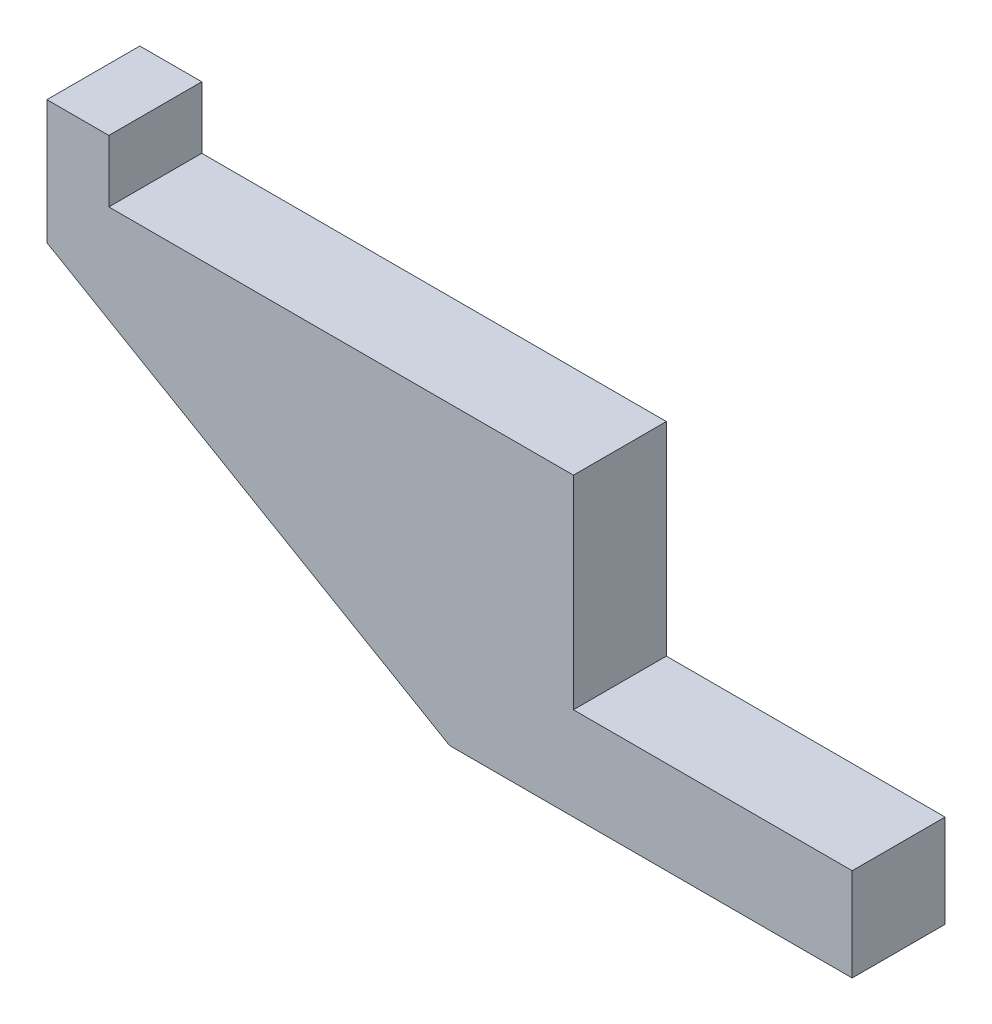
ISO-10303-21;
HEADER;
FILE_DESCRIPTION(('STEP AP214'),'2;1');
FILE_NAME('part.step','',(''),(''),'','','');
FILE_SCHEMA(('AUTOMOTIVE_DESIGN { 1 0 10303 214 1 1 1 1 }'));
ENDSEC;
DATA;
#1=APPLICATION_CONTEXT('core data for automotive mechanical design processes');
#2=APPLICATION_PROTOCOL_DEFINITION('international standard','automotive_design',2000,#1);
#3=PRODUCT_CONTEXT('',#1,'mechanical');
#4=PRODUCT('Part','Part','',(#3));
#5=PRODUCT_RELATED_PRODUCT_CATEGORY('part','',(#4));
#6=PRODUCT_DEFINITION_FORMATION('','',#4);
#7=PRODUCT_DEFINITION_CONTEXT('part definition',#1,'design');
#8=PRODUCT_DEFINITION('design','',#6,#7);
#9=PRODUCT_DEFINITION_SHAPE('','',#8);
#10=(LENGTH_UNIT() NAMED_UNIT(*) SI_UNIT(.MILLI.,.METRE.));
#11=(NAMED_UNIT(*) PLANE_ANGLE_UNIT() SI_UNIT($,.RADIAN.));
#12=(NAMED_UNIT(*) SI_UNIT($,.STERADIAN.) SOLID_ANGLE_UNIT());
#13=UNCERTAINTY_MEASURE_WITH_UNIT(LENGTH_MEASURE(1.E-05),#10,'distance_accuracy_value','');
#14=(GEOMETRIC_REPRESENTATION_CONTEXT(3) GLOBAL_UNCERTAINTY_ASSIGNED_CONTEXT((#13)) GLOBAL_UNIT_ASSIGNED_CONTEXT((#10,
#11,#12)) REPRESENTATION_CONTEXT('',''));
#15=CARTESIAN_POINT('',(0.,0.,0.));
#16=DIRECTION('',(0.,0.,1.));
#17=DIRECTION('',(1.,0.,0.));
#18=AXIS2_PLACEMENT_3D('',#15,#16,#17);
#19=CARTESIAN_POINT('',(-138.982059533364,-238.990314012398,-7.5));
#20=DIRECTION('',(0.502712915161017,0.86445342554143,0.));
#21=DIRECTION('',(-0.86445342554143,0.502712915161017,0.));
#22=AXIS2_PLACEMENT_3D('',#19,#20,#21);
#23=PLANE('',#22);
#24=DIRECTION('',(0.,0.,1.));
#25=VECTOR('',#24,1.);
#26=CARTESIAN_POINT('',(-516.871999051619,-19.2327799540888,-7.5));
#27=LINE('',#26,#25);
#28=CARTESIAN_POINT('',(-516.871999051619,-19.2327799540888,-7.5));
#29=VERTEX_POINT('',#28);
#30=CARTESIAN_POINT('',(-516.871999051619,-19.2327799540888,7.5));
#31=VERTEX_POINT('',#30);
#32=EDGE_CURVE('E42',#29,#31,#27,.T.);
#33=ORIENTED_EDGE('',*,*,#32,.T.);
#34=DIRECTION('',(-0.86445342554143,0.502712915161017,0.));
#35=VECTOR('',#34,1.);
#36=CARTESIAN_POINT('',(-138.982059533364,-238.990314012398,7.5));
#37=LINE('',#36,#35);
#38=CARTESIAN_POINT('',(-581.871999051619,18.5672200459112,7.5));
#39=VERTEX_POINT('',#38);
#40=EDGE_CURVE('E115',#31,#39,#37,.T.);
#41=ORIENTED_EDGE('',*,*,#40,.T.);
#42=DIRECTION('',(0.,0.,1.));
#43=VECTOR('',#42,1.);
#44=CARTESIAN_POINT('',(-581.871999051619,18.5672200459112,-7.5));
#45=LINE('',#44,#43);
#46=CARTESIAN_POINT('',(-581.871999051619,18.5672200459112,-7.5));
#47=VERTEX_POINT('',#46);
#48=EDGE_CURVE('E11',#47,#39,#45,.T.);
#49=ORIENTED_EDGE('',*,*,#48,.F.);
#50=DIRECTION('',(-0.86445342554143,0.502712915161017,0.));
#51=VECTOR('',#50,1.);
#52=CARTESIAN_POINT('',(-138.982059533364,-238.990314012398,-7.5));
#53=LINE('',#52,#51);
#54=EDGE_CURVE('E112',#29,#47,#53,.T.);
#55=ORIENTED_EDGE('',*,*,#54,.F.);
#56=EDGE_LOOP('',(#33,#41,#49,#55));
#57=FACE_BOUND('',#56,.T.);
#58=ADVANCED_FACE('F41',(#57),#23,.F.);
#59=CARTESIAN_POINT('',(-581.871999051619,0.,-7.5));
#60=DIRECTION('',(1.,0.,0.));
#61=DIRECTION('',(0.,0.,-1.));
#62=AXIS2_PLACEMENT_3D('',#59,#60,#61);
#63=PLANE('',#62);
#64=ORIENTED_EDGE('',*,*,#48,.T.);
#65=DIRECTION('',(0.,1.,0.));
#66=VECTOR('',#65,1.);
#67=CARTESIAN_POINT('',(-581.871999051619,0.,7.5));
#68=LINE('',#67,#66);
#69=CARTESIAN_POINT('',(-581.871999051619,38.5672200459112,7.5));
#70=VERTEX_POINT('',#69);
#71=EDGE_CURVE('E130',#39,#70,#68,.T.);
#72=ORIENTED_EDGE('',*,*,#71,.T.);
#73=DIRECTION('',(0.,0.,1.));
#74=VECTOR('',#73,1.);
#75=CARTESIAN_POINT('',(-581.871999051619,38.5672200459112,-7.5));
#76=LINE('',#75,#74);
#77=CARTESIAN_POINT('',(-581.871999051619,38.5672200459112,-7.5));
#78=VERTEX_POINT('',#77);
#79=EDGE_CURVE('E47',#78,#70,#76,.T.);
#80=ORIENTED_EDGE('',*,*,#79,.F.);
#81=DIRECTION('',(0.,1.,0.));
#82=VECTOR('',#81,1.);
#83=CARTESIAN_POINT('',(-581.871999051619,0.,-7.5));
#84=LINE('',#83,#82);
#85=EDGE_CURVE('E57',#47,#78,#84,.T.);
#86=ORIENTED_EDGE('',*,*,#85,.F.);
#87=EDGE_LOOP('',(#64,#72,#80,#86));
#88=FACE_BOUND('',#87,.T.);
#89=ADVANCED_FACE('F203',(#88),#63,.F.);
#90=CARTESIAN_POINT('',(0.,38.5672200459108,-7.5));
#91=DIRECTION('',(0.,-1.,0.));
#92=DIRECTION('',(1.,0.,0.));
#93=AXIS2_PLACEMENT_3D('',#90,#91,#92);
#94=PLANE('',#93);
#95=ORIENTED_EDGE('',*,*,#79,.T.);
#96=DIRECTION('',(1.,0.,0.));
#97=VECTOR('',#96,1.);
#98=CARTESIAN_POINT('',(0.,38.5672200459108,7.5));
#99=LINE('',#98,#97);
#100=CARTESIAN_POINT('',(-571.871999051619,38.5672200459112,7.5));
#101=VERTEX_POINT('',#100);
#102=EDGE_CURVE('E150',#70,#101,#99,.T.);
#103=ORIENTED_EDGE('',*,*,#102,.T.);
#104=DIRECTION('',(0.,0.,1.));
#105=VECTOR('',#104,1.);
#106=CARTESIAN_POINT('',(-571.871999051619,38.5672200459112,-7.5));
#107=LINE('',#106,#105);
#108=CARTESIAN_POINT('',(-571.871999051619,38.5672200459112,-7.5));
#109=VERTEX_POINT('',#108);
#110=EDGE_CURVE('E166',#109,#101,#107,.T.);
#111=ORIENTED_EDGE('',*,*,#110,.F.);
#112=DIRECTION('',(1.,0.,0.));
#113=VECTOR('',#112,1.);
#114=CARTESIAN_POINT('',(0.,38.5672200459108,-7.5));
#115=LINE('',#114,#113);
#116=EDGE_CURVE('E165',#78,#109,#115,.T.);
#117=ORIENTED_EDGE('',*,*,#116,.F.);
#118=EDGE_LOOP('',(#95,#103,#111,#117));
#119=FACE_BOUND('',#118,.T.);
#120=ADVANCED_FACE('F202',(#119),#94,.F.);
#121=CARTESIAN_POINT('',(-571.871999051619,0.,-7.5));
#122=DIRECTION('',(-1.,0.,0.));
#123=DIRECTION('',(0.,0.,1.));
#124=AXIS2_PLACEMENT_3D('',#121,#122,#123);
#125=PLANE('',#124);
#126=ORIENTED_EDGE('',*,*,#110,.T.);
#127=DIRECTION('',(0.,-1.,0.));
#128=VECTOR('',#127,1.);
#129=CARTESIAN_POINT('',(-571.871999051619,0.,7.5));
#130=LINE('',#129,#128);
#131=CARTESIAN_POINT('',(-571.871999051619,28.5672200459112,7.5));
#132=VERTEX_POINT('',#131);
#133=EDGE_CURVE('E144',#101,#132,#130,.T.);
#134=ORIENTED_EDGE('',*,*,#133,.T.);
#135=DIRECTION('',(0.,0.,1.));
#136=VECTOR('',#135,1.);
#137=CARTESIAN_POINT('',(-571.871999051619,28.5672200459112,-7.5));
#138=LINE('',#137,#136);
#139=CARTESIAN_POINT('',(-571.871999051619,28.5672200459112,-7.5));
#140=VERTEX_POINT('',#139);
#141=EDGE_CURVE('E167',#140,#132,#138,.T.);
#142=ORIENTED_EDGE('',*,*,#141,.F.);
#143=DIRECTION('',(0.,-1.,0.));
#144=VECTOR('',#143,1.);
#145=CARTESIAN_POINT('',(-571.871999051619,0.,-7.5));
#146=LINE('',#145,#144);
#147=EDGE_CURVE('E162',#109,#140,#146,.T.);
#148=ORIENTED_EDGE('',*,*,#147,.F.);
#149=EDGE_LOOP('',(#126,#134,#142,#148));
#150=FACE_BOUND('',#149,.T.);
#151=ADVANCED_FACE('F198',(#150),#125,.F.);
#152=CARTESIAN_POINT('',(0.,28.5672200459112,-7.5));
#153=DIRECTION('',(0.,-1.,0.));
#154=DIRECTION('',(0.,0.,-1.));
#155=AXIS2_PLACEMENT_3D('',#152,#153,#154);
#156=PLANE('',#155);
#157=ORIENTED_EDGE('',*,*,#141,.T.);
#158=DIRECTION('',(1.,0.,0.));
#159=VECTOR('',#158,1.);
#160=CARTESIAN_POINT('',(0.,28.5672200459112,7.5));
#161=LINE('',#160,#159);
#162=CARTESIAN_POINT('',(-496.871999051619,28.5672200459112,7.5));
#163=VERTEX_POINT('',#162);
#164=EDGE_CURVE('E142',#132,#163,#161,.T.);
#165=ORIENTED_EDGE('',*,*,#164,.T.);
#166=DIRECTION('',(0.,0.,1.));
#167=VECTOR('',#166,1.);
#168=CARTESIAN_POINT('',(-496.871999051619,28.5672200459112,-7.5));
#169=LINE('',#168,#167);
#170=CARTESIAN_POINT('',(-496.871999051619,28.5672200459112,-7.5));
#171=VERTEX_POINT('',#170);
#172=EDGE_CURVE('E175',#171,#163,#169,.T.);
#173=ORIENTED_EDGE('',*,*,#172,.F.);
#174=DIRECTION('',(1.,0.,0.));
#175=VECTOR('',#174,1.);
#176=CARTESIAN_POINT('',(0.,28.5672200459112,-7.5));
#177=LINE('',#176,#175);
#178=EDGE_CURVE('E160',#140,#171,#177,.T.);
#179=ORIENTED_EDGE('',*,*,#178,.F.);
#180=EDGE_LOOP('',(#157,#165,#173,#179));
#181=FACE_BOUND('',#180,.T.);
#182=ADVANCED_FACE('F191',(#181),#156,.F.);
#183=CARTESIAN_POINT('',(-496.871999051619,0.,-7.5));
#184=DIRECTION('',(-1.,0.,0.));
#185=DIRECTION('',(0.,0.,1.));
#186=AXIS2_PLACEMENT_3D('',#183,#184,#185);
#187=PLANE('',#186);
#188=ORIENTED_EDGE('',*,*,#172,.T.);
#189=DIRECTION('',(0.,-1.,0.));
#190=VECTOR('',#189,1.);
#191=CARTESIAN_POINT('',(-496.871999051619,0.,7.5));
#192=LINE('',#191,#190);
#193=CARTESIAN_POINT('',(-496.871999051619,-4.2327799540888,7.5));
#194=VERTEX_POINT('',#193);
#195=EDGE_CURVE('E139',#163,#194,#192,.T.);
#196=ORIENTED_EDGE('',*,*,#195,.T.);
#197=DIRECTION('',(0.,0.,1.));
#198=VECTOR('',#197,1.);
#199=CARTESIAN_POINT('',(-496.871999051619,-4.2327799540888,-7.5));
#200=LINE('',#199,#198);
#201=CARTESIAN_POINT('',(-496.871999051619,-4.2327799540888,-7.5));
#202=VERTEX_POINT('',#201);
#203=EDGE_CURVE('E172',#202,#194,#200,.T.);
#204=ORIENTED_EDGE('',*,*,#203,.F.);
#205=DIRECTION('',(0.,-1.,0.));
#206=VECTOR('',#205,1.);
#207=CARTESIAN_POINT('',(-496.871999051619,0.,-7.5));
#208=LINE('',#207,#206);
#209=EDGE_CURVE('E159',#171,#202,#208,.T.);
#210=ORIENTED_EDGE('',*,*,#209,.F.);
#211=EDGE_LOOP('',(#188,#196,#204,#210));
#212=FACE_BOUND('',#211,.T.);
#213=ADVANCED_FACE('F186',(#212),#187,.F.);
#214=CARTESIAN_POINT('',(0.,-4.2327799540888,-7.5));
#215=DIRECTION('',(0.,-1.,0.));
#216=DIRECTION('',(0.,0.,-1.));
#217=AXIS2_PLACEMENT_3D('',#214,#215,#216);
#218=PLANE('',#217);
#219=ORIENTED_EDGE('',*,*,#203,.T.);
#220=DIRECTION('',(1.,0.,0.));
#221=VECTOR('',#220,1.);
#222=CARTESIAN_POINT('',(0.,-4.2327799540888,7.5));
#223=LINE('',#222,#221);
#224=CARTESIAN_POINT('',(-451.871999051619,-4.2327799540888,7.5));
#225=VERTEX_POINT('',#224);
#226=EDGE_CURVE('E134',#194,#225,#223,.T.);
#227=ORIENTED_EDGE('',*,*,#226,.T.);
#228=DIRECTION('',(0.,0.,1.));
#229=VECTOR('',#228,1.);
#230=CARTESIAN_POINT('',(-451.871999051619,-4.2327799540888,-7.5));
#231=LINE('',#230,#229);
#232=CARTESIAN_POINT('',(-451.871999051619,-4.2327799540888,-7.5));
#233=VERTEX_POINT('',#232);
#234=EDGE_CURVE('E176',#233,#225,#231,.T.);
#235=ORIENTED_EDGE('',*,*,#234,.F.);
#236=DIRECTION('',(1.,0.,0.));
#237=VECTOR('',#236,1.);
#238=CARTESIAN_POINT('',(0.,-4.2327799540888,-7.5));
#239=LINE('',#238,#237);
#240=EDGE_CURVE('E156',#202,#233,#239,.T.);
#241=ORIENTED_EDGE('',*,*,#240,.F.);
#242=EDGE_LOOP('',(#219,#227,#235,#241));
#243=FACE_BOUND('',#242,.T.);
#244=ADVANCED_FACE('F184',(#243),#218,.F.);
#245=CARTESIAN_POINT('',(-451.871999051619,0.,-7.5));
#246=DIRECTION('',(-1.,0.,0.));
#247=DIRECTION('',(0.,0.,1.));
#248=AXIS2_PLACEMENT_3D('',#245,#246,#247);
#249=PLANE('',#248);
#250=ORIENTED_EDGE('',*,*,#234,.T.);
#251=DIRECTION('',(0.,-1.,0.));
#252=VECTOR('',#251,1.);
#253=CARTESIAN_POINT('',(-451.871999051619,0.,7.5));
#254=LINE('',#253,#252);
#255=CARTESIAN_POINT('',(-451.871999051619,-19.2327799540888,7.5));
#256=VERTEX_POINT('',#255);
#257=EDGE_CURVE('E131',#225,#256,#254,.T.);
#258=ORIENTED_EDGE('',*,*,#257,.T.);
#259=DIRECTION('',(0.,0.,1.));
#260=VECTOR('',#259,1.);
#261=CARTESIAN_POINT('',(-451.871999051619,-19.2327799540888,-7.5));
#262=LINE('',#261,#260);
#263=CARTESIAN_POINT('',(-451.871999051619,-19.2327799540888,-7.5));
#264=VERTEX_POINT('',#263);
#265=EDGE_CURVE('E117',#264,#256,#262,.T.);
#266=ORIENTED_EDGE('',*,*,#265,.F.);
#267=DIRECTION('',(0.,-1.,0.));
#268=VECTOR('',#267,1.);
#269=CARTESIAN_POINT('',(-451.871999051619,0.,-7.5));
#270=LINE('',#269,#268);
#271=EDGE_CURVE('E153',#233,#264,#270,.T.);
#272=ORIENTED_EDGE('',*,*,#271,.F.);
#273=EDGE_LOOP('',(#250,#258,#266,#272));
#274=FACE_BOUND('',#273,.T.);
#275=ADVANCED_FACE('F179',(#274),#249,.F.);
#276=CARTESIAN_POINT('',(0.,-19.2327799540887,-7.5));
#277=DIRECTION('',(0.,1.,0.));
#278=DIRECTION('',(-1.,0.,0.));
#279=AXIS2_PLACEMENT_3D('',#276,#277,#278);
#280=PLANE('',#279);
#281=ORIENTED_EDGE('',*,*,#265,.T.);
#282=DIRECTION('',(-1.,0.,0.));
#283=VECTOR('',#282,1.);
#284=CARTESIAN_POINT('',(0.,-19.2327799540887,7.5));
#285=LINE('',#284,#283);
#286=EDGE_CURVE('E124',#256,#31,#285,.T.);
#287=ORIENTED_EDGE('',*,*,#286,.T.);
#288=ORIENTED_EDGE('',*,*,#32,.F.);
#289=DIRECTION('',(-1.,0.,0.));
#290=VECTOR('',#289,1.);
#291=CARTESIAN_POINT('',(0.,-19.2327799540887,-7.5));
#292=LINE('',#291,#290);
#293=EDGE_CURVE('E152',#264,#29,#292,.T.);
#294=ORIENTED_EDGE('',*,*,#293,.F.);
#295=EDGE_LOOP('',(#281,#287,#288,#294));
#296=FACE_BOUND('',#295,.T.);
#297=ADVANCED_FACE('F126',(#296),#280,.F.);
#298=CARTESIAN_POINT('',(0.,0.,-7.5));
#299=DIRECTION('',(0.,0.,1.));
#300=DIRECTION('',(1.,0.,0.));
#301=AXIS2_PLACEMENT_3D('',#298,#299,#300);
#302=PLANE('',#301);
#303=ORIENTED_EDGE('',*,*,#54,.T.);
#304=ORIENTED_EDGE('',*,*,#85,.T.);
#305=ORIENTED_EDGE('',*,*,#116,.T.);
#306=ORIENTED_EDGE('',*,*,#147,.T.);
#307=ORIENTED_EDGE('',*,*,#178,.T.);
#308=ORIENTED_EDGE('',*,*,#209,.T.);
#309=ORIENTED_EDGE('',*,*,#240,.T.);
#310=ORIENTED_EDGE('',*,*,#271,.T.);
#311=ORIENTED_EDGE('',*,*,#293,.T.);
#312=EDGE_LOOP('',(#303,#304,#305,#306,#307,#308,#309,#310,#311));
#313=FACE_BOUND('',#312,.T.);
#314=ADVANCED_FACE('F214',(#313),#302,.F.);
#315=CARTESIAN_POINT('',(0.,0.,7.5));
#316=DIRECTION('',(0.,0.,1.));
#317=DIRECTION('',(1.,0.,0.));
#318=AXIS2_PLACEMENT_3D('',#315,#316,#317);
#319=PLANE('',#318);
#320=ORIENTED_EDGE('',*,*,#40,.F.);
#321=ORIENTED_EDGE('',*,*,#286,.F.);
#322=ORIENTED_EDGE('',*,*,#257,.F.);
#323=ORIENTED_EDGE('',*,*,#226,.F.);
#324=ORIENTED_EDGE('',*,*,#195,.F.);
#325=ORIENTED_EDGE('',*,*,#164,.F.);
#326=ORIENTED_EDGE('',*,*,#133,.F.);
#327=ORIENTED_EDGE('',*,*,#102,.F.);
#328=ORIENTED_EDGE('',*,*,#71,.F.);
#329=EDGE_LOOP('',(#320,#321,#322,#323,#324,#325,#326,#327,#328));
#330=FACE_BOUND('',#329,.T.);
#331=ADVANCED_FACE('F122',(#330),#319,.T.);
#332=CLOSED_SHELL('',(#58,#89,#120,#151,#182,#213,#244,#275,#297,#314,#331));
#333=MANIFOLD_SOLID_BREP('B2',#332);
#334=ADVANCED_BREP_SHAPE_REPRESENTATION('',(#18,#333),#14);
#335=SHAPE_DEFINITION_REPRESENTATION(#9,#334);
ENDSEC;
END-ISO-10303-21;
